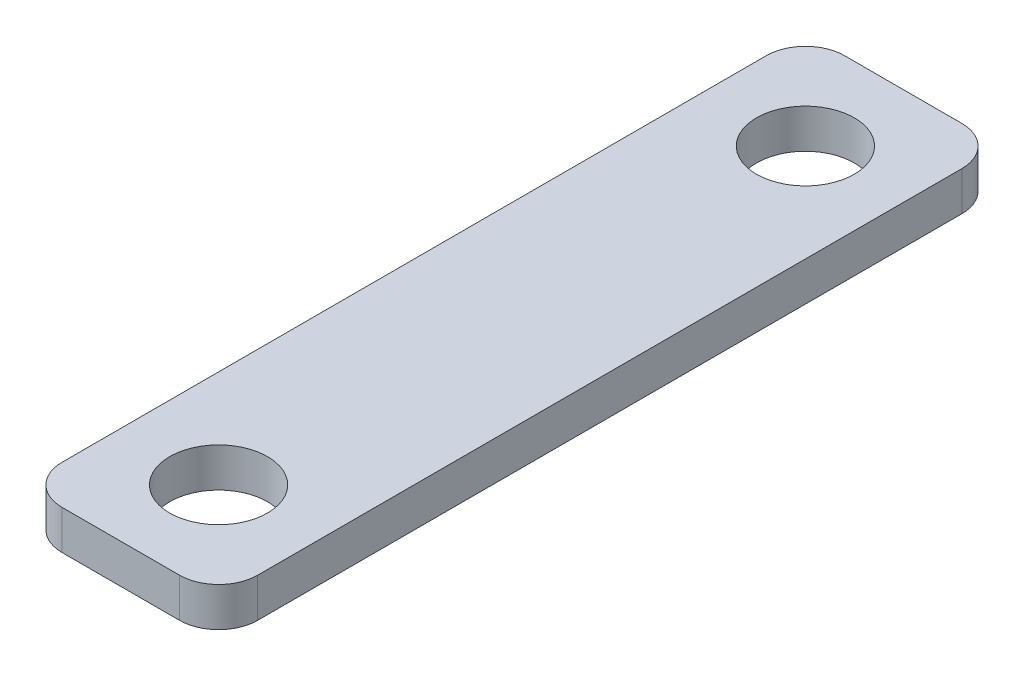
ISO-10303-21;
HEADER;
FILE_DESCRIPTION(('STEP AP214'),'2;1');
FILE_NAME('part.step','',(''),(''),'','','');
FILE_SCHEMA(('AUTOMOTIVE_DESIGN { 1 0 10303 214 1 1 1 1 }'));
ENDSEC;
DATA;
#1=APPLICATION_CONTEXT('core data for automotive mechanical design processes');
#2=APPLICATION_PROTOCOL_DEFINITION('international standard','automotive_design',2000,#1);
#3=PRODUCT_CONTEXT('',#1,'mechanical');
#4=PRODUCT('Part','Part','',(#3));
#5=PRODUCT_RELATED_PRODUCT_CATEGORY('part','',(#4));
#6=PRODUCT_DEFINITION_FORMATION('','',#4);
#7=PRODUCT_DEFINITION_CONTEXT('part definition',#1,'design');
#8=PRODUCT_DEFINITION('design','',#6,#7);
#9=PRODUCT_DEFINITION_SHAPE('','',#8);
#10=(LENGTH_UNIT() NAMED_UNIT(*) SI_UNIT(.MILLI.,.METRE.));
#11=(NAMED_UNIT(*) PLANE_ANGLE_UNIT() SI_UNIT($,.RADIAN.));
#12=(NAMED_UNIT(*) SI_UNIT($,.STERADIAN.) SOLID_ANGLE_UNIT());
#13=UNCERTAINTY_MEASURE_WITH_UNIT(LENGTH_MEASURE(1.E-05),#10,'distance_accuracy_value','');
#14=(GEOMETRIC_REPRESENTATION_CONTEXT(3) GLOBAL_UNCERTAINTY_ASSIGNED_CONTEXT((#13)) GLOBAL_UNIT_ASSIGNED_CONTEXT((#10,
#11,#12)) REPRESENTATION_CONTEXT('',''));
#15=CARTESIAN_POINT('',(0.,0.,0.));
#16=DIRECTION('',(0.,0.,1.));
#17=DIRECTION('',(1.,0.,0.));
#18=AXIS2_PLACEMENT_3D('',#15,#16,#17);
#19=CARTESIAN_POINT('',(40.,10.,-10.));
#20=DIRECTION('',(0.,1.,0.));
#21=DIRECTION('',(0.,0.,1.));
#22=AXIS2_PLACEMENT_3D('',#19,#20,#21);
#23=PLANE('',#22);
#24=CARTESIAN_POINT('',(25.,10.,-25.));
#25=DIRECTION('',(0.,1.,0.));
#26=DIRECTION('',(0.,0.,1.));
#27=AXIS2_PLACEMENT_3D('',#24,#25,#26);
#28=CIRCLE('',#27,12.5);
#29=CARTESIAN_POINT('',(25.,10.,-12.5));
#30=VERTEX_POINT('',#29);
#31=EDGE_CURVE('E134',#30,#30,#28,.T.);
#32=ORIENTED_EDGE('',*,*,#31,.F.);
#33=EDGE_LOOP('',(#32));
#34=FACE_BOUND('',#33,.T.);
#35=CARTESIAN_POINT('',(40.,10.,-10.));
#36=DIRECTION('',(0.,1.,0.));
#37=DIRECTION('',(0.,0.,1.));
#38=AXIS2_PLACEMENT_3D('',#35,#36,#37);
#39=CIRCLE('',#38,10.);
#40=CARTESIAN_POINT('',(39.9999999999999,10.,0.));
#41=VERTEX_POINT('',#40);
#42=CARTESIAN_POINT('',(50.,10.,-10.0000000000001));
#43=VERTEX_POINT('',#42);
#44=EDGE_CURVE('E145',#41,#43,#39,.T.);
#45=ORIENTED_EDGE('',*,*,#44,.T.);
#46=DIRECTION('',(0.,0.,-1.));
#47=VECTOR('',#46,1.);
#48=CARTESIAN_POINT('',(50.,10.,-10.0000000000001));
#49=LINE('',#48,#47);
#50=CARTESIAN_POINT('',(50.,10.,-190.));
#51=VERTEX_POINT('',#50);
#52=EDGE_CURVE('E93',#43,#51,#49,.T.);
#53=ORIENTED_EDGE('',*,*,#52,.T.);
#54=CARTESIAN_POINT('',(40.,10.,-190.));
#55=DIRECTION('',(0.,1.,0.));
#56=DIRECTION('',(0.,0.,-1.));
#57=AXIS2_PLACEMENT_3D('',#54,#55,#56);
#58=CIRCLE('',#57,10.);
#59=CARTESIAN_POINT('',(39.9999999999999,10.,-200.));
#60=VERTEX_POINT('',#59);
#61=EDGE_CURVE('E160',#51,#60,#58,.T.);
#62=ORIENTED_EDGE('',*,*,#61,.T.);
#63=DIRECTION('',(-1.,0.,0.));
#64=VECTOR('',#63,1.);
#65=CARTESIAN_POINT('',(10.,10.,-200.));
#66=LINE('',#65,#64);
#67=CARTESIAN_POINT('',(10.,10.,-200.));
#68=VERTEX_POINT('',#67);
#69=EDGE_CURVE('E173',#60,#68,#66,.T.);
#70=ORIENTED_EDGE('',*,*,#69,.T.);
#71=CARTESIAN_POINT('',(9.99999999999997,10.,-190.));
#72=DIRECTION('',(0.,1.,0.));
#73=DIRECTION('',(0.,0.,-1.));
#74=AXIS2_PLACEMENT_3D('',#71,#72,#73);
#75=CIRCLE('',#74,10.);
#76=CARTESIAN_POINT('',(0.,10.,-190.));
#77=VERTEX_POINT('',#76);
#78=EDGE_CURVE('E112',#68,#77,#75,.T.);
#79=ORIENTED_EDGE('',*,*,#78,.T.);
#80=DIRECTION('',(0.,0.,1.));
#81=VECTOR('',#80,1.);
#82=CARTESIAN_POINT('',(0.,10.,-10.0000000000001));
#83=LINE('',#82,#81);
#84=CARTESIAN_POINT('',(0.,10.,-10.0000000000001));
#85=VERTEX_POINT('',#84);
#86=EDGE_CURVE('E106',#77,#85,#83,.T.);
#87=ORIENTED_EDGE('',*,*,#86,.T.);
#88=CARTESIAN_POINT('',(10.,10.,-10.));
#89=DIRECTION('',(0.,1.,0.));
#90=DIRECTION('',(0.,0.,-1.));
#91=AXIS2_PLACEMENT_3D('',#88,#89,#90);
#92=CIRCLE('',#91,10.);
#93=CARTESIAN_POINT('',(10.0000000000001,10.,0.));
#94=VERTEX_POINT('',#93);
#95=EDGE_CURVE('E110',#85,#94,#92,.T.);
#96=ORIENTED_EDGE('',*,*,#95,.T.);
#97=DIRECTION('',(1.,0.,0.));
#98=VECTOR('',#97,1.);
#99=CARTESIAN_POINT('',(10.0000000000001,10.,0.));
#100=LINE('',#99,#98);
#101=EDGE_CURVE('E50',#94,#41,#100,.T.);
#102=ORIENTED_EDGE('',*,*,#101,.T.);
#103=EDGE_LOOP('',(#45,#53,#62,#70,#79,#87,#96,#102));
#104=FACE_BOUND('',#103,.T.);
#105=CARTESIAN_POINT('',(25.,10.,-175.));
#106=DIRECTION('',(0.,1.,0.));
#107=DIRECTION('',(0.,0.,1.));
#108=AXIS2_PLACEMENT_3D('',#105,#106,#107);
#109=CIRCLE('',#108,12.5);
#110=CARTESIAN_POINT('',(25.,10.,-162.5));
#111=VERTEX_POINT('',#110);
#112=EDGE_CURVE('E182',#111,#111,#109,.T.);
#113=ORIENTED_EDGE('',*,*,#112,.F.);
#114=EDGE_LOOP('',(#113));
#115=FACE_BOUND('',#114,.T.);
#116=ADVANCED_FACE('F33',(#34,#104,#115),#23,.T.);
#117=CARTESIAN_POINT('',(40.,0.,-10.));
#118=DIRECTION('',(0.,1.,0.));
#119=DIRECTION('',(0.,0.,1.));
#120=AXIS2_PLACEMENT_3D('',#117,#118,#119);
#121=PLANE('',#120);
#122=CARTESIAN_POINT('',(25.,0.,-25.));
#123=DIRECTION('',(0.,1.,0.));
#124=DIRECTION('',(0.,0.,1.));
#125=AXIS2_PLACEMENT_3D('',#122,#123,#124);
#126=CIRCLE('',#125,12.5);
#127=CARTESIAN_POINT('',(25.,0.,-12.5));
#128=VERTEX_POINT('',#127);
#129=EDGE_CURVE('E179',#128,#128,#126,.T.);
#130=ORIENTED_EDGE('',*,*,#129,.T.);
#131=EDGE_LOOP('',(#130));
#132=FACE_BOUND('',#131,.T.);
#133=CARTESIAN_POINT('',(40.,0.,-10.));
#134=DIRECTION('',(0.,1.,0.));
#135=DIRECTION('',(0.,0.,1.));
#136=AXIS2_PLACEMENT_3D('',#133,#134,#135);
#137=CIRCLE('',#136,10.);
#138=CARTESIAN_POINT('',(39.9999999999999,0.,0.));
#139=VERTEX_POINT('',#138);
#140=CARTESIAN_POINT('',(50.,0.,-10.0000000000001));
#141=VERTEX_POINT('',#140);
#142=EDGE_CURVE('E130',#139,#141,#137,.T.);
#143=ORIENTED_EDGE('',*,*,#142,.F.);
#144=DIRECTION('',(1.,0.,0.));
#145=VECTOR('',#144,1.);
#146=CARTESIAN_POINT('',(10.0000000000001,0.,0.));
#147=LINE('',#146,#145);
#148=CARTESIAN_POINT('',(10.0000000000001,0.,0.));
#149=VERTEX_POINT('',#148);
#150=EDGE_CURVE('E85',#149,#139,#147,.T.);
#151=ORIENTED_EDGE('',*,*,#150,.F.);
#152=CARTESIAN_POINT('',(10.,0.,-10.));
#153=DIRECTION('',(0.,1.,0.));
#154=DIRECTION('',(0.,0.,-1.));
#155=AXIS2_PLACEMENT_3D('',#152,#153,#154);
#156=CIRCLE('',#155,10.);
#157=CARTESIAN_POINT('',(0.,0.,-10.0000000000001));
#158=VERTEX_POINT('',#157);
#159=EDGE_CURVE('E79',#158,#149,#156,.T.);
#160=ORIENTED_EDGE('',*,*,#159,.F.);
#161=DIRECTION('',(0.,0.,1.));
#162=VECTOR('',#161,1.);
#163=CARTESIAN_POINT('',(0.,0.,-10.0000000000001));
#164=LINE('',#163,#162);
#165=CARTESIAN_POINT('',(0.,0.,-190.));
#166=VERTEX_POINT('',#165);
#167=EDGE_CURVE('E120',#166,#158,#164,.T.);
#168=ORIENTED_EDGE('',*,*,#167,.F.);
#169=CARTESIAN_POINT('',(9.99999999999997,0.,-190.));
#170=DIRECTION('',(0.,1.,0.));
#171=DIRECTION('',(0.,0.,-1.));
#172=AXIS2_PLACEMENT_3D('',#169,#170,#171);
#173=CIRCLE('',#172,10.);
#174=CARTESIAN_POINT('',(10.,0.,-200.));
#175=VERTEX_POINT('',#174);
#176=EDGE_CURVE('E140',#175,#166,#173,.T.);
#177=ORIENTED_EDGE('',*,*,#176,.F.);
#178=DIRECTION('',(-1.,0.,0.));
#179=VECTOR('',#178,1.);
#180=CARTESIAN_POINT('',(10.,0.,-200.));
#181=LINE('',#180,#179);
#182=CARTESIAN_POINT('',(39.9999999999999,0.,-200.));
#183=VERTEX_POINT('',#182);
#184=EDGE_CURVE('E138',#183,#175,#181,.T.);
#185=ORIENTED_EDGE('',*,*,#184,.F.);
#186=CARTESIAN_POINT('',(40.,0.,-190.));
#187=DIRECTION('',(0.,1.,0.));
#188=DIRECTION('',(0.,0.,-1.));
#189=AXIS2_PLACEMENT_3D('',#186,#187,#188);
#190=CIRCLE('',#189,10.);
#191=CARTESIAN_POINT('',(50.,0.,-190.));
#192=VERTEX_POINT('',#191);
#193=EDGE_CURVE('E136',#192,#183,#190,.T.);
#194=ORIENTED_EDGE('',*,*,#193,.F.);
#195=DIRECTION('',(0.,0.,-1.));
#196=VECTOR('',#195,1.);
#197=CARTESIAN_POINT('',(50.,0.,-10.0000000000001));
#198=LINE('',#197,#196);
#199=EDGE_CURVE('E133',#141,#192,#198,.T.);
#200=ORIENTED_EDGE('',*,*,#199,.F.);
#201=EDGE_LOOP('',(#143,#151,#160,#168,#177,#185,#194,#200));
#202=FACE_BOUND('',#201,.T.);
#203=CARTESIAN_POINT('',(25.,0.,-175.));
#204=DIRECTION('',(0.,1.,0.));
#205=DIRECTION('',(0.,0.,1.));
#206=AXIS2_PLACEMENT_3D('',#203,#204,#205);
#207=CIRCLE('',#206,12.5);
#208=CARTESIAN_POINT('',(25.,0.,-162.5));
#209=VERTEX_POINT('',#208);
#210=EDGE_CURVE('E185',#209,#209,#207,.T.);
#211=ORIENTED_EDGE('',*,*,#210,.T.);
#212=EDGE_LOOP('',(#211));
#213=FACE_BOUND('',#212,.T.);
#214=ADVANCED_FACE('F164',(#132,#202,#213),#121,.F.);
#215=CARTESIAN_POINT('',(40.,10.,-10.));
#216=DIRECTION('',(0.,-1.,0.));
#217=DIRECTION('',(0.,0.,-1.));
#218=AXIS2_PLACEMENT_3D('',#215,#216,#217);
#219=CYLINDRICAL_SURFACE('',#218,10.);
#220=ORIENTED_EDGE('',*,*,#142,.T.);
#221=DIRECTION('',(0.,-1.,0.));
#222=VECTOR('',#221,1.);
#223=CARTESIAN_POINT('',(50.,10.,-10.0000000000001));
#224=LINE('',#223,#222);
#225=EDGE_CURVE('E11',#43,#141,#224,.T.);
#226=ORIENTED_EDGE('',*,*,#225,.F.);
#227=ORIENTED_EDGE('',*,*,#44,.F.);
#228=DIRECTION('',(0.,-1.,0.));
#229=VECTOR('',#228,1.);
#230=CARTESIAN_POINT('',(39.9999999999999,10.,0.));
#231=LINE('',#230,#229);
#232=EDGE_CURVE('E126',#41,#139,#231,.T.);
#233=ORIENTED_EDGE('',*,*,#232,.T.);
#234=EDGE_LOOP('',(#220,#226,#227,#233));
#235=FACE_BOUND('',#234,.T.);
#236=ADVANCED_FACE('F35',(#235),#219,.T.);
#237=CARTESIAN_POINT('',(50.,10.,-10.0000000000001));
#238=DIRECTION('',(-1.,0.,0.));
#239=DIRECTION('',(0.,0.,1.));
#240=AXIS2_PLACEMENT_3D('',#237,#238,#239);
#241=PLANE('',#240);
#242=ORIENTED_EDGE('',*,*,#199,.T.);
#243=DIRECTION('',(0.,-1.,0.));
#244=VECTOR('',#243,1.);
#245=CARTESIAN_POINT('',(50.,10.,-190.));
#246=LINE('',#245,#244);
#247=EDGE_CURVE('E42',#51,#192,#246,.T.);
#248=ORIENTED_EDGE('',*,*,#247,.F.);
#249=ORIENTED_EDGE('',*,*,#52,.F.);
#250=ORIENTED_EDGE('',*,*,#225,.T.);
#251=EDGE_LOOP('',(#242,#248,#249,#250));
#252=FACE_BOUND('',#251,.T.);
#253=ADVANCED_FACE('F218',(#252),#241,.F.);
#254=CARTESIAN_POINT('',(40.,10.,-190.));
#255=DIRECTION('',(0.,-1.,0.));
#256=DIRECTION('',(0.,0.,-1.));
#257=AXIS2_PLACEMENT_3D('',#254,#255,#256);
#258=CYLINDRICAL_SURFACE('',#257,10.);
#259=ORIENTED_EDGE('',*,*,#193,.T.);
#260=DIRECTION('',(0.,-1.,0.));
#261=VECTOR('',#260,1.);
#262=CARTESIAN_POINT('',(39.9999999999999,10.,-200.));
#263=LINE('',#262,#261);
#264=EDGE_CURVE('E152',#60,#183,#263,.T.);
#265=ORIENTED_EDGE('',*,*,#264,.F.);
#266=ORIENTED_EDGE('',*,*,#61,.F.);
#267=ORIENTED_EDGE('',*,*,#247,.T.);
#268=EDGE_LOOP('',(#259,#265,#266,#267));
#269=FACE_BOUND('',#268,.T.);
#270=ADVANCED_FACE('F158',(#269),#258,.T.);
#271=CARTESIAN_POINT('',(10.,10.,-200.));
#272=DIRECTION('',(0.,0.,1.));
#273=DIRECTION('',(1.,0.,0.));
#274=AXIS2_PLACEMENT_3D('',#271,#272,#273);
#275=PLANE('',#274);
#276=ORIENTED_EDGE('',*,*,#184,.T.);
#277=DIRECTION('',(0.,-1.,0.));
#278=VECTOR('',#277,1.);
#279=CARTESIAN_POINT('',(10.,10.,-200.));
#280=LINE('',#279,#278);
#281=EDGE_CURVE('E149',#68,#175,#280,.T.);
#282=ORIENTED_EDGE('',*,*,#281,.F.);
#283=ORIENTED_EDGE('',*,*,#69,.F.);
#284=ORIENTED_EDGE('',*,*,#264,.T.);
#285=EDGE_LOOP('',(#276,#282,#283,#284));
#286=FACE_BOUND('',#285,.T.);
#287=ADVANCED_FACE('F169',(#286),#275,.F.);
#288=CARTESIAN_POINT('',(9.99999999999997,10.,-190.));
#289=DIRECTION('',(0.,-1.,0.));
#290=DIRECTION('',(0.,0.,-1.));
#291=AXIS2_PLACEMENT_3D('',#288,#289,#290);
#292=CYLINDRICAL_SURFACE('',#291,10.);
#293=ORIENTED_EDGE('',*,*,#176,.T.);
#294=DIRECTION('',(0.,-1.,0.));
#295=VECTOR('',#294,1.);
#296=CARTESIAN_POINT('',(0.,10.,-190.));
#297=LINE('',#296,#295);
#298=EDGE_CURVE('E121',#77,#166,#297,.T.);
#299=ORIENTED_EDGE('',*,*,#298,.F.);
#300=ORIENTED_EDGE('',*,*,#78,.F.);
#301=ORIENTED_EDGE('',*,*,#281,.T.);
#302=EDGE_LOOP('',(#293,#299,#300,#301));
#303=FACE_BOUND('',#302,.T.);
#304=ADVANCED_FACE('F172',(#303),#292,.T.);
#305=CARTESIAN_POINT('',(0.,10.,-10.0000000000001));
#306=DIRECTION('',(1.,0.,0.));
#307=DIRECTION('',(0.,0.,-1.));
#308=AXIS2_PLACEMENT_3D('',#305,#306,#307);
#309=PLANE('',#308);
#310=ORIENTED_EDGE('',*,*,#167,.T.);
#311=DIRECTION('',(0.,-1.,0.));
#312=VECTOR('',#311,1.);
#313=CARTESIAN_POINT('',(0.,10.,-10.0000000000001));
#314=LINE('',#313,#312);
#315=EDGE_CURVE('E117',#85,#158,#314,.T.);
#316=ORIENTED_EDGE('',*,*,#315,.F.);
#317=ORIENTED_EDGE('',*,*,#86,.F.);
#318=ORIENTED_EDGE('',*,*,#298,.T.);
#319=EDGE_LOOP('',(#310,#316,#317,#318));
#320=FACE_BOUND('',#319,.T.);
#321=ADVANCED_FACE('F118',(#320),#309,.F.);
#322=CARTESIAN_POINT('',(10.,10.,-10.));
#323=DIRECTION('',(0.,-1.,0.));
#324=DIRECTION('',(0.,0.,-1.));
#325=AXIS2_PLACEMENT_3D('',#322,#323,#324);
#326=CYLINDRICAL_SURFACE('',#325,10.);
#327=ORIENTED_EDGE('',*,*,#159,.T.);
#328=DIRECTION('',(0.,-1.,0.));
#329=VECTOR('',#328,1.);
#330=CARTESIAN_POINT('',(10.0000000000001,10.,0.));
#331=LINE('',#330,#329);
#332=EDGE_CURVE('E122',#94,#149,#331,.T.);
#333=ORIENTED_EDGE('',*,*,#332,.F.);
#334=ORIENTED_EDGE('',*,*,#95,.F.);
#335=ORIENTED_EDGE('',*,*,#315,.T.);
#336=EDGE_LOOP('',(#327,#333,#334,#335));
#337=FACE_BOUND('',#336,.T.);
#338=ADVANCED_FACE('F124',(#337),#326,.T.);
#339=CARTESIAN_POINT('',(10.0000000000001,10.,0.));
#340=DIRECTION('',(0.,0.,-1.));
#341=DIRECTION('',(-1.,0.,0.));
#342=AXIS2_PLACEMENT_3D('',#339,#340,#341);
#343=PLANE('',#342);
#344=ORIENTED_EDGE('',*,*,#150,.T.);
#345=ORIENTED_EDGE('',*,*,#232,.F.);
#346=ORIENTED_EDGE('',*,*,#101,.F.);
#347=ORIENTED_EDGE('',*,*,#332,.T.);
#348=EDGE_LOOP('',(#344,#345,#346,#347));
#349=FACE_BOUND('',#348,.T.);
#350=ADVANCED_FACE('F206',(#349),#343,.F.);
#351=CARTESIAN_POINT('',(25.,10.,-25.));
#352=DIRECTION('',(0.,-1.,0.));
#353=DIRECTION('',(0.,0.,-1.));
#354=AXIS2_PLACEMENT_3D('',#351,#352,#353);
#355=CYLINDRICAL_SURFACE('',#354,12.5);
#356=ORIENTED_EDGE('',*,*,#31,.T.);
#357=EDGE_LOOP('',(#356));
#358=FACE_BOUND('',#357,.T.);
#359=ORIENTED_EDGE('',*,*,#129,.F.);
#360=EDGE_LOOP('',(#359));
#361=FACE_BOUND('',#360,.T.);
#362=ADVANCED_FACE('F203',(#358,#361),#355,.F.);
#363=CARTESIAN_POINT('',(25.,10.,-175.));
#364=DIRECTION('',(0.,-1.,0.));
#365=DIRECTION('',(0.,0.,-1.));
#366=AXIS2_PLACEMENT_3D('',#363,#364,#365);
#367=CYLINDRICAL_SURFACE('',#366,12.5);
#368=ORIENTED_EDGE('',*,*,#112,.T.);
#369=EDGE_LOOP('',(#368));
#370=FACE_BOUND('',#369,.T.);
#371=ORIENTED_EDGE('',*,*,#210,.F.);
#372=EDGE_LOOP('',(#371));
#373=FACE_BOUND('',#372,.T.);
#374=ADVANCED_FACE('F191',(#370,#373),#367,.F.);
#375=CLOSED_SHELL('',(#116,#214,#236,#253,#270,#287,#304,#321,#338,#350,#362,#374));
#376=MANIFOLD_SOLID_BREP('B2',#375);
#377=ADVANCED_BREP_SHAPE_REPRESENTATION('',(#18,#376),#14);
#378=SHAPE_DEFINITION_REPRESENTATION(#9,#377);
ENDSEC;
END-ISO-10303-21;
